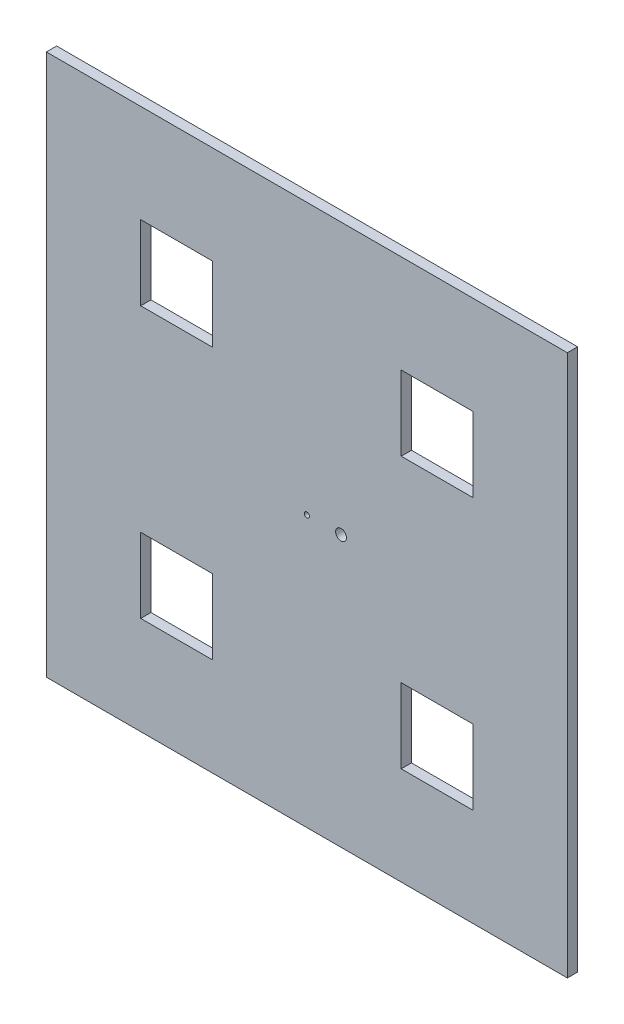
ISO-10303-21;
HEADER;
FILE_DESCRIPTION(('STEP AP214'),'2;1');
FILE_NAME('part.step','',(''),(''),'','','');
FILE_SCHEMA(('AUTOMOTIVE_DESIGN { 1 0 10303 214 1 1 1 1 }'));
ENDSEC;
DATA;
#1=APPLICATION_CONTEXT('core data for automotive mechanical design processes');
#2=APPLICATION_PROTOCOL_DEFINITION('international standard','automotive_design',2000,#1);
#3=PRODUCT_CONTEXT('',#1,'mechanical');
#4=PRODUCT('Part','Part','',(#3));
#5=PRODUCT_RELATED_PRODUCT_CATEGORY('part','',(#4));
#6=PRODUCT_DEFINITION_FORMATION('','',#4);
#7=PRODUCT_DEFINITION_CONTEXT('part definition',#1,'design');
#8=PRODUCT_DEFINITION('design','',#6,#7);
#9=PRODUCT_DEFINITION_SHAPE('','',#8);
#10=(LENGTH_UNIT() NAMED_UNIT(*) SI_UNIT(.MILLI.,.METRE.));
#11=(NAMED_UNIT(*) PLANE_ANGLE_UNIT() SI_UNIT($,.RADIAN.));
#12=(NAMED_UNIT(*) SI_UNIT($,.STERADIAN.) SOLID_ANGLE_UNIT());
#13=UNCERTAINTY_MEASURE_WITH_UNIT(LENGTH_MEASURE(1.E-05),#10,'distance_accuracy_value','');
#14=(GEOMETRIC_REPRESENTATION_CONTEXT(3) GLOBAL_UNCERTAINTY_ASSIGNED_CONTEXT((#13)) GLOBAL_UNIT_ASSIGNED_CONTEXT((#10,
#11,#12)) REPRESENTATION_CONTEXT('',''));
#15=CARTESIAN_POINT('',(0.,0.,0.));
#16=DIRECTION('',(0.,0.,1.));
#17=DIRECTION('',(1.,0.,0.));
#18=AXIS2_PLACEMENT_3D('',#15,#16,#17);
#19=CARTESIAN_POINT('',(-152.4,-158.4,6.));
#20=DIRECTION('',(1.,0.,0.));
#21=DIRECTION('',(0.,0.,-1.));
#22=AXIS2_PLACEMENT_3D('',#19,#20,#21);
#23=PLANE('',#22);
#24=DIRECTION('',(0.,-1.,0.));
#25=VECTOR('',#24,1.);
#26=CARTESIAN_POINT('',(-152.4,-158.4,0.));
#27=LINE('',#26,#25);
#28=CARTESIAN_POINT('',(-152.4,158.4,0.));
#29=VERTEX_POINT('',#28);
#30=CARTESIAN_POINT('',(-152.4,-158.4,0.));
#31=VERTEX_POINT('',#30);
#32=EDGE_CURVE('E300',#29,#31,#27,.T.);
#33=ORIENTED_EDGE('',*,*,#32,.T.);
#34=DIRECTION('',(0.,0.,-1.));
#35=VECTOR('',#34,1.);
#36=CARTESIAN_POINT('',(-152.4,-158.4,6.));
#37=LINE('',#36,#35);
#38=CARTESIAN_POINT('',(-152.4,-158.4,6.));
#39=VERTEX_POINT('',#38);
#40=EDGE_CURVE('E11',#39,#31,#37,.T.);
#41=ORIENTED_EDGE('',*,*,#40,.F.);
#42=DIRECTION('',(0.,-1.,0.));
#43=VECTOR('',#42,1.);
#44=CARTESIAN_POINT('',(-152.4,-158.4,6.));
#45=LINE('',#44,#43);
#46=CARTESIAN_POINT('',(-152.4,158.4,6.));
#47=VERTEX_POINT('',#46);
#48=EDGE_CURVE('E307',#47,#39,#45,.T.);
#49=ORIENTED_EDGE('',*,*,#48,.F.);
#50=DIRECTION('',(0.,0.,-1.));
#51=VECTOR('',#50,1.);
#52=CARTESIAN_POINT('',(-152.4,158.4,6.));
#53=LINE('',#52,#51);
#54=EDGE_CURVE('E317',#47,#29,#53,.T.);
#55=ORIENTED_EDGE('',*,*,#54,.T.);
#56=EDGE_LOOP('',(#33,#41,#49,#55));
#57=FACE_BOUND('',#56,.T.);
#58=ADVANCED_FACE('F33',(#57),#23,.F.);
#59=CARTESIAN_POINT('',(152.4,-158.4,6.));
#60=DIRECTION('',(0.,1.,0.));
#61=DIRECTION('',(-1.,0.,0.));
#62=AXIS2_PLACEMENT_3D('',#59,#60,#61);
#63=PLANE('',#62);
#64=DIRECTION('',(1.,0.,0.));
#65=VECTOR('',#64,1.);
#66=CARTESIAN_POINT('',(152.4,-158.4,0.));
#67=LINE('',#66,#65);
#68=CARTESIAN_POINT('',(152.4,-158.4,0.));
#69=VERTEX_POINT('',#68);
#70=EDGE_CURVE('E320',#31,#69,#67,.T.);
#71=ORIENTED_EDGE('',*,*,#70,.T.);
#72=DIRECTION('',(0.,0.,-1.));
#73=VECTOR('',#72,1.);
#74=CARTESIAN_POINT('',(152.4,-158.4,6.));
#75=LINE('',#74,#73);
#76=CARTESIAN_POINT('',(152.4,-158.4,6.));
#77=VERTEX_POINT('',#76);
#78=EDGE_CURVE('E40',#77,#69,#75,.T.);
#79=ORIENTED_EDGE('',*,*,#78,.F.);
#80=DIRECTION('',(1.,0.,0.));
#81=VECTOR('',#80,1.);
#82=CARTESIAN_POINT('',(152.4,-158.4,6.));
#83=LINE('',#82,#81);
#84=EDGE_CURVE('E310',#39,#77,#83,.T.);
#85=ORIENTED_EDGE('',*,*,#84,.F.);
#86=ORIENTED_EDGE('',*,*,#40,.T.);
#87=EDGE_LOOP('',(#71,#79,#85,#86));
#88=FACE_BOUND('',#87,.T.);
#89=ADVANCED_FACE('F349',(#88),#63,.F.);
#90=CARTESIAN_POINT('',(152.4,-158.4,6.));
#91=DIRECTION('',(-1.,0.,0.));
#92=DIRECTION('',(0.,0.,1.));
#93=AXIS2_PLACEMENT_3D('',#90,#91,#92);
#94=PLANE('',#93);
#95=DIRECTION('',(0.,1.,0.));
#96=VECTOR('',#95,1.);
#97=CARTESIAN_POINT('',(152.4,-158.4,0.));
#98=LINE('',#97,#96);
#99=CARTESIAN_POINT('',(152.4,158.4,0.));
#100=VERTEX_POINT('',#99);
#101=EDGE_CURVE('E322',#69,#100,#98,.T.);
#102=ORIENTED_EDGE('',*,*,#101,.T.);
#103=DIRECTION('',(0.,0.,-1.));
#104=VECTOR('',#103,1.);
#105=CARTESIAN_POINT('',(152.4,158.4,6.));
#106=LINE('',#105,#104);
#107=CARTESIAN_POINT('',(152.4,158.4,6.));
#108=VERTEX_POINT('',#107);
#109=EDGE_CURVE('E327',#108,#100,#106,.T.);
#110=ORIENTED_EDGE('',*,*,#109,.F.);
#111=DIRECTION('',(0.,1.,0.));
#112=VECTOR('',#111,1.);
#113=CARTESIAN_POINT('',(152.4,-158.4,6.));
#114=LINE('',#113,#112);
#115=EDGE_CURVE('E313',#77,#108,#114,.T.);
#116=ORIENTED_EDGE('',*,*,#115,.F.);
#117=ORIENTED_EDGE('',*,*,#78,.T.);
#118=EDGE_LOOP('',(#102,#110,#116,#117));
#119=FACE_BOUND('',#118,.T.);
#120=ADVANCED_FACE('F334',(#119),#94,.F.);
#121=CARTESIAN_POINT('',(152.4,158.4,6.));
#122=DIRECTION('',(0.,-1.,0.));
#123=DIRECTION('',(1.,0.,0.));
#124=AXIS2_PLACEMENT_3D('',#121,#122,#123);
#125=PLANE('',#124);
#126=DIRECTION('',(-1.,0.,0.));
#127=VECTOR('',#126,1.);
#128=CARTESIAN_POINT('',(152.4,158.4,0.));
#129=LINE('',#128,#127);
#130=EDGE_CURVE('E311',#100,#29,#129,.T.);
#131=ORIENTED_EDGE('',*,*,#130,.T.);
#132=ORIENTED_EDGE('',*,*,#54,.F.);
#133=DIRECTION('',(-1.,0.,0.));
#134=VECTOR('',#133,1.);
#135=CARTESIAN_POINT('',(152.4,158.4,6.));
#136=LINE('',#135,#134);
#137=EDGE_CURVE('E315',#108,#47,#136,.T.);
#138=ORIENTED_EDGE('',*,*,#137,.F.);
#139=ORIENTED_EDGE('',*,*,#109,.T.);
#140=EDGE_LOOP('',(#131,#132,#138,#139));
#141=FACE_BOUND('',#140,.T.);
#142=ADVANCED_FACE('F342',(#141),#125,.F.);
#143=CARTESIAN_POINT('',(0.,0.,6.));
#144=DIRECTION('',(0.,0.,1.));
#145=DIRECTION('',(1.,0.,0.));
#146=AXIS2_PLACEMENT_3D('',#143,#144,#145);
#147=PLANE('',#146);
#148=CARTESIAN_POINT('',(20.,0.,6.));
#149=DIRECTION('',(0.,0.,1.));
#150=DIRECTION('',(1.,0.,0.));
#151=AXIS2_PLACEMENT_3D('',#148,#149,#150);
#152=CIRCLE('',#151,3.17500000000001);
#153=CARTESIAN_POINT('',(23.175,0.,6.));
#154=VERTEX_POINT('',#153);
#155=EDGE_CURVE('E439',#154,#154,#152,.T.);
#156=ORIENTED_EDGE('',*,*,#155,.F.);
#157=EDGE_LOOP('',(#156));
#158=FACE_BOUND('',#157,.T.);
#159=CARTESIAN_POINT('',(0.,0.,6.));
#160=DIRECTION('',(0.,0.,1.));
#161=DIRECTION('',(1.,0.,0.));
#162=AXIS2_PLACEMENT_3D('',#159,#160,#161);
#163=CIRCLE('',#162,1.5);
#164=CARTESIAN_POINT('',(1.5,0.,6.));
#165=VERTEX_POINT('',#164);
#166=EDGE_CURVE('E196',#165,#165,#163,.T.);
#167=ORIENTED_EDGE('',*,*,#166,.F.);
#168=EDGE_LOOP('',(#167));
#169=FACE_BOUND('',#168,.T.);
#170=DIRECTION('',(0.,-1.,0.));
#171=VECTOR('',#170,1.);
#172=CARTESIAN_POINT('',(55.2000000000001,57.3732283464567,6.));
#173=LINE('',#172,#171);
#174=CARTESIAN_POINT('',(55.2000000000001,101.026771653543,6.));
#175=VERTEX_POINT('',#174);
#176=CARTESIAN_POINT('',(55.2000000000001,57.3732283464567,6.));
#177=VERTEX_POINT('',#176);
#178=EDGE_CURVE('E47',#175,#177,#173,.T.);
#179=ORIENTED_EDGE('',*,*,#178,.F.);
#180=DIRECTION('',(-1.,0.,0.));
#181=VECTOR('',#180,1.);
#182=CARTESIAN_POINT('',(97.2000000000001,101.026771653543,6.));
#183=LINE('',#182,#181);
#184=CARTESIAN_POINT('',(97.2000000000001,101.026771653543,6.));
#185=VERTEX_POINT('',#184);
#186=EDGE_CURVE('E190',#185,#175,#183,.T.);
#187=ORIENTED_EDGE('',*,*,#186,.F.);
#188=DIRECTION('',(0.,1.,0.));
#189=VECTOR('',#188,1.);
#190=CARTESIAN_POINT('',(97.2000000000001,57.3732283464567,6.));
#191=LINE('',#190,#189);
#192=CARTESIAN_POINT('',(97.2000000000001,57.3732283464567,6.));
#193=VERTEX_POINT('',#192);
#194=EDGE_CURVE('E193',#193,#185,#191,.T.);
#195=ORIENTED_EDGE('',*,*,#194,.F.);
#196=DIRECTION('',(1.,0.,0.));
#197=VECTOR('',#196,1.);
#198=CARTESIAN_POINT('',(97.2000000000001,57.3732283464567,6.));
#199=LINE('',#198,#197);
#200=EDGE_CURVE('E202',#177,#193,#199,.T.);
#201=ORIENTED_EDGE('',*,*,#200,.F.);
#202=EDGE_LOOP('',(#179,#187,#195,#201));
#203=FACE_BOUND('',#202,.T.);
#204=DIRECTION('',(0.,-1.,0.));
#205=VECTOR('',#204,1.);
#206=CARTESIAN_POINT('',(55.2000000000001,-101.026771653543,6.));
#207=LINE('',#206,#205);
#208=CARTESIAN_POINT('',(55.2000000000001,-57.3732283464567,6.));
#209=VERTEX_POINT('',#208);
#210=CARTESIAN_POINT('',(55.2000000000001,-101.026771653543,6.));
#211=VERTEX_POINT('',#210);
#212=EDGE_CURVE('E55',#209,#211,#207,.T.);
#213=ORIENTED_EDGE('',*,*,#212,.F.);
#214=DIRECTION('',(-1.,0.,0.));
#215=VECTOR('',#214,1.);
#216=CARTESIAN_POINT('',(97.2000000000001,-57.3732283464567,6.));
#217=LINE('',#216,#215);
#218=CARTESIAN_POINT('',(97.2000000000001,-57.3732283464567,6.));
#219=VERTEX_POINT('',#218);
#220=EDGE_CURVE('E217',#219,#209,#217,.T.);
#221=ORIENTED_EDGE('',*,*,#220,.F.);
#222=DIRECTION('',(0.,1.,0.));
#223=VECTOR('',#222,1.);
#224=CARTESIAN_POINT('',(97.2000000000001,-101.026771653543,6.));
#225=LINE('',#224,#223);
#226=CARTESIAN_POINT('',(97.2000000000001,-101.026771653543,6.));
#227=VERTEX_POINT('',#226);
#228=EDGE_CURVE('E232',#227,#219,#225,.T.);
#229=ORIENTED_EDGE('',*,*,#228,.F.);
#230=DIRECTION('',(1.,0.,0.));
#231=VECTOR('',#230,1.);
#232=CARTESIAN_POINT('',(97.2000000000001,-101.026771653543,6.));
#233=LINE('',#232,#231);
#234=EDGE_CURVE('E228',#211,#227,#233,.T.);
#235=ORIENTED_EDGE('',*,*,#234,.F.);
#236=EDGE_LOOP('',(#213,#221,#229,#235));
#237=FACE_BOUND('',#236,.T.);
#238=DIRECTION('',(0.,-1.,0.));
#239=VECTOR('',#238,1.);
#240=CARTESIAN_POINT('',(-97.2,-101.026771653543,6.));
#241=LINE('',#240,#239);
#242=CARTESIAN_POINT('',(-97.2,-57.3732283464567,6.));
#243=VERTEX_POINT('',#242);
#244=CARTESIAN_POINT('',(-97.2,-101.026771653543,6.));
#245=VERTEX_POINT('',#244);
#246=EDGE_CURVE('E257',#243,#245,#241,.T.);
#247=ORIENTED_EDGE('',*,*,#246,.F.);
#248=DIRECTION('',(-1.,0.,0.));
#249=VECTOR('',#248,1.);
#250=CARTESIAN_POINT('',(-55.2,-57.3732283464567,6.));
#251=LINE('',#250,#249);
#252=CARTESIAN_POINT('',(-55.2,-57.3732283464567,6.));
#253=VERTEX_POINT('',#252);
#254=EDGE_CURVE('E247',#253,#243,#251,.T.);
#255=ORIENTED_EDGE('',*,*,#254,.F.);
#256=DIRECTION('',(0.,1.,0.));
#257=VECTOR('',#256,1.);
#258=CARTESIAN_POINT('',(-55.2,-101.026771653543,6.));
#259=LINE('',#258,#257);
#260=CARTESIAN_POINT('',(-55.2,-101.026771653543,6.));
#261=VERTEX_POINT('',#260);
#262=EDGE_CURVE('E263',#261,#253,#259,.T.);
#263=ORIENTED_EDGE('',*,*,#262,.F.);
#264=DIRECTION('',(1.,0.,0.));
#265=VECTOR('',#264,1.);
#266=CARTESIAN_POINT('',(-55.2,-101.026771653543,6.));
#267=LINE('',#266,#265);
#268=EDGE_CURVE('E259',#245,#261,#267,.T.);
#269=ORIENTED_EDGE('',*,*,#268,.F.);
#270=EDGE_LOOP('',(#247,#255,#263,#269));
#271=FACE_BOUND('',#270,.T.);
#272=DIRECTION('',(0.,-1.,0.));
#273=VECTOR('',#272,1.);
#274=CARTESIAN_POINT('',(-97.2000000000001,57.3732283464567,6.));
#275=LINE('',#274,#273);
#276=CARTESIAN_POINT('',(-97.2000000000001,101.026771653543,6.));
#277=VERTEX_POINT('',#276);
#278=CARTESIAN_POINT('',(-97.2000000000001,57.3732283464567,6.));
#279=VERTEX_POINT('',#278);
#280=EDGE_CURVE('E209',#277,#279,#275,.T.);
#281=ORIENTED_EDGE('',*,*,#280,.F.);
#282=DIRECTION('',(-1.,0.,0.));
#283=VECTOR('',#282,1.);
#284=CARTESIAN_POINT('',(-55.2000000000001,101.026771653543,6.));
#285=LINE('',#284,#283);
#286=CARTESIAN_POINT('',(-55.2000000000001,101.026771653543,6.));
#287=VERTEX_POINT('',#286);
#288=EDGE_CURVE('E279',#287,#277,#285,.T.);
#289=ORIENTED_EDGE('',*,*,#288,.F.);
#290=DIRECTION('',(0.,1.,0.));
#291=VECTOR('',#290,1.);
#292=CARTESIAN_POINT('',(-55.2000000000001,57.3732283464567,6.));
#293=LINE('',#292,#291);
#294=CARTESIAN_POINT('',(-55.2000000000001,57.3732283464567,6.));
#295=VERTEX_POINT('',#294);
#296=EDGE_CURVE('E293',#295,#287,#293,.T.);
#297=ORIENTED_EDGE('',*,*,#296,.F.);
#298=DIRECTION('',(1.,0.,0.));
#299=VECTOR('',#298,1.);
#300=CARTESIAN_POINT('',(-55.2000000000001,57.3732283464567,6.));
#301=LINE('',#300,#299);
#302=EDGE_CURVE('E290',#279,#295,#301,.T.);
#303=ORIENTED_EDGE('',*,*,#302,.F.);
#304=EDGE_LOOP('',(#281,#289,#297,#303));
#305=FACE_BOUND('',#304,.T.);
#306=ORIENTED_EDGE('',*,*,#48,.T.);
#307=ORIENTED_EDGE('',*,*,#84,.T.);
#308=ORIENTED_EDGE('',*,*,#115,.T.);
#309=ORIENTED_EDGE('',*,*,#137,.T.);
#310=EDGE_LOOP('',(#306,#307,#308,#309));
#311=FACE_BOUND('',#310,.T.);
#312=ADVANCED_FACE('F348',(#158,#169,#203,#237,#271,#305,#311),#147,.T.);
#313=CARTESIAN_POINT('',(0.,0.,0.));
#314=DIRECTION('',(0.,0.,1.));
#315=DIRECTION('',(1.,0.,0.));
#316=AXIS2_PLACEMENT_3D('',#313,#314,#315);
#317=PLANE('',#316);
#318=CARTESIAN_POINT('',(20.,0.,0.));
#319=DIRECTION('',(0.,0.,1.));
#320=DIRECTION('',(1.,0.,0.));
#321=AXIS2_PLACEMENT_3D('',#318,#319,#320);
#322=CIRCLE('',#321,3.17500000000001);
#323=CARTESIAN_POINT('',(23.175,0.,0.));
#324=VERTEX_POINT('',#323);
#325=EDGE_CURVE('E436',#324,#324,#322,.T.);
#326=ORIENTED_EDGE('',*,*,#325,.T.);
#327=EDGE_LOOP('',(#326));
#328=FACE_BOUND('',#327,.T.);
#329=CARTESIAN_POINT('',(0.,0.,0.));
#330=DIRECTION('',(0.,0.,1.));
#331=DIRECTION('',(1.,0.,0.));
#332=AXIS2_PLACEMENT_3D('',#329,#330,#331);
#333=CIRCLE('',#332,1.5);
#334=CARTESIAN_POINT('',(1.5,0.,0.));
#335=VERTEX_POINT('',#334);
#336=EDGE_CURVE('E260',#335,#335,#333,.T.);
#337=ORIENTED_EDGE('',*,*,#336,.T.);
#338=EDGE_LOOP('',(#337));
#339=FACE_BOUND('',#338,.T.);
#340=DIRECTION('',(-1.,0.,0.));
#341=VECTOR('',#340,1.);
#342=CARTESIAN_POINT('',(97.2000000000001,101.026771653543,0.));
#343=LINE('',#342,#341);
#344=CARTESIAN_POINT('',(97.2000000000001,101.026771653543,0.));
#345=VERTEX_POINT('',#344);
#346=CARTESIAN_POINT('',(55.2000000000001,101.026771653543,0.));
#347=VERTEX_POINT('',#346);
#348=EDGE_CURVE('E177',#345,#347,#343,.T.);
#349=ORIENTED_EDGE('',*,*,#348,.T.);
#350=DIRECTION('',(0.,-1.,0.));
#351=VECTOR('',#350,1.);
#352=CARTESIAN_POINT('',(55.2000000000001,57.3732283464567,0.));
#353=LINE('',#352,#351);
#354=CARTESIAN_POINT('',(55.2000000000001,57.3732283464567,0.));
#355=VERTEX_POINT('',#354);
#356=EDGE_CURVE('E171',#347,#355,#353,.T.);
#357=ORIENTED_EDGE('',*,*,#356,.T.);
#358=DIRECTION('',(1.,0.,0.));
#359=VECTOR('',#358,1.);
#360=CARTESIAN_POINT('',(97.2000000000001,57.3732283464567,0.));
#361=LINE('',#360,#359);
#362=CARTESIAN_POINT('',(97.2000000000001,57.3732283464567,0.));
#363=VERTEX_POINT('',#362);
#364=EDGE_CURVE('E181',#355,#363,#361,.T.);
#365=ORIENTED_EDGE('',*,*,#364,.T.);
#366=DIRECTION('',(0.,1.,0.));
#367=VECTOR('',#366,1.);
#368=CARTESIAN_POINT('',(97.2000000000001,57.3732283464567,0.));
#369=LINE('',#368,#367);
#370=EDGE_CURVE('E185',#363,#345,#369,.T.);
#371=ORIENTED_EDGE('',*,*,#370,.T.);
#372=EDGE_LOOP('',(#349,#357,#365,#371));
#373=FACE_BOUND('',#372,.T.);
#374=DIRECTION('',(-1.,0.,0.));
#375=VECTOR('',#374,1.);
#376=CARTESIAN_POINT('',(97.2000000000001,-57.3732283464567,0.));
#377=LINE('',#376,#375);
#378=CARTESIAN_POINT('',(97.2000000000001,-57.3732283464567,0.));
#379=VERTEX_POINT('',#378);
#380=CARTESIAN_POINT('',(55.2000000000001,-57.3732283464567,0.));
#381=VERTEX_POINT('',#380);
#382=EDGE_CURVE('E223',#379,#381,#377,.T.);
#383=ORIENTED_EDGE('',*,*,#382,.T.);
#384=DIRECTION('',(0.,-1.,0.));
#385=VECTOR('',#384,1.);
#386=CARTESIAN_POINT('',(55.2000000000001,-101.026771653543,0.));
#387=LINE('',#386,#385);
#388=CARTESIAN_POINT('',(55.2000000000001,-101.026771653543,0.));
#389=VERTEX_POINT('',#388);
#390=EDGE_CURVE('E213',#381,#389,#387,.T.);
#391=ORIENTED_EDGE('',*,*,#390,.T.);
#392=DIRECTION('',(1.,0.,0.));
#393=VECTOR('',#392,1.);
#394=CARTESIAN_POINT('',(97.2000000000001,-101.026771653543,0.));
#395=LINE('',#394,#393);
#396=CARTESIAN_POINT('',(97.2000000000001,-101.026771653543,0.));
#397=VERTEX_POINT('',#396);
#398=EDGE_CURVE('E216',#389,#397,#395,.T.);
#399=ORIENTED_EDGE('',*,*,#398,.T.);
#400=DIRECTION('',(0.,1.,0.));
#401=VECTOR('',#400,1.);
#402=CARTESIAN_POINT('',(97.2000000000001,-101.026771653543,0.));
#403=LINE('',#402,#401);
#404=EDGE_CURVE('E220',#397,#379,#403,.T.);
#405=ORIENTED_EDGE('',*,*,#404,.T.);
#406=EDGE_LOOP('',(#383,#391,#399,#405));
#407=FACE_BOUND('',#406,.T.);
#408=DIRECTION('',(-1.,0.,0.));
#409=VECTOR('',#408,1.);
#410=CARTESIAN_POINT('',(-55.2,-57.3732283464567,0.));
#411=LINE('',#410,#409);
#412=CARTESIAN_POINT('',(-55.2,-57.3732283464567,0.));
#413=VERTEX_POINT('',#412);
#414=CARTESIAN_POINT('',(-97.2,-57.3732283464567,0.));
#415=VERTEX_POINT('',#414);
#416=EDGE_CURVE('E253',#413,#415,#411,.T.);
#417=ORIENTED_EDGE('',*,*,#416,.T.);
#418=DIRECTION('',(0.,-1.,0.));
#419=VECTOR('',#418,1.);
#420=CARTESIAN_POINT('',(-97.2,-101.026771653543,0.));
#421=LINE('',#420,#419);
#422=CARTESIAN_POINT('',(-97.2,-101.026771653543,0.));
#423=VERTEX_POINT('',#422);
#424=EDGE_CURVE('E243',#415,#423,#421,.T.);
#425=ORIENTED_EDGE('',*,*,#424,.T.);
#426=DIRECTION('',(1.,0.,0.));
#427=VECTOR('',#426,1.);
#428=CARTESIAN_POINT('',(-55.2,-101.026771653543,0.));
#429=LINE('',#428,#427);
#430=CARTESIAN_POINT('',(-55.2,-101.026771653543,0.));
#431=VERTEX_POINT('',#430);
#432=EDGE_CURVE('E246',#423,#431,#429,.T.);
#433=ORIENTED_EDGE('',*,*,#432,.T.);
#434=DIRECTION('',(0.,1.,0.));
#435=VECTOR('',#434,1.);
#436=CARTESIAN_POINT('',(-55.2,-101.026771653543,0.));
#437=LINE('',#436,#435);
#438=EDGE_CURVE('E250',#431,#413,#437,.T.);
#439=ORIENTED_EDGE('',*,*,#438,.T.);
#440=EDGE_LOOP('',(#417,#425,#433,#439));
#441=FACE_BOUND('',#440,.T.);
#442=DIRECTION('',(-1.,0.,0.));
#443=VECTOR('',#442,1.);
#444=CARTESIAN_POINT('',(-55.2000000000001,101.026771653543,0.));
#445=LINE('',#444,#443);
#446=CARTESIAN_POINT('',(-55.2000000000001,101.026771653543,0.));
#447=VERTEX_POINT('',#446);
#448=CARTESIAN_POINT('',(-97.2000000000001,101.026771653543,0.));
#449=VERTEX_POINT('',#448);
#450=EDGE_CURVE('E285',#447,#449,#445,.T.);
#451=ORIENTED_EDGE('',*,*,#450,.T.);
#452=DIRECTION('',(0.,-1.,0.));
#453=VECTOR('',#452,1.);
#454=CARTESIAN_POINT('',(-97.2000000000001,57.3732283464567,0.));
#455=LINE('',#454,#453);
#456=CARTESIAN_POINT('',(-97.2000000000001,57.3732283464567,0.));
#457=VERTEX_POINT('',#456);
#458=EDGE_CURVE('E275',#449,#457,#455,.T.);
#459=ORIENTED_EDGE('',*,*,#458,.T.);
#460=DIRECTION('',(1.,0.,0.));
#461=VECTOR('',#460,1.);
#462=CARTESIAN_POINT('',(-55.2000000000001,57.3732283464567,0.));
#463=LINE('',#462,#461);
#464=CARTESIAN_POINT('',(-55.2000000000001,57.3732283464567,0.));
#465=VERTEX_POINT('',#464);
#466=EDGE_CURVE('E278',#457,#465,#463,.T.);
#467=ORIENTED_EDGE('',*,*,#466,.T.);
#468=DIRECTION('',(0.,1.,0.));
#469=VECTOR('',#468,1.);
#470=CARTESIAN_POINT('',(-55.2000000000001,57.3732283464567,0.));
#471=LINE('',#470,#469);
#472=EDGE_CURVE('E282',#465,#447,#471,.T.);
#473=ORIENTED_EDGE('',*,*,#472,.T.);
#474=EDGE_LOOP('',(#451,#459,#467,#473));
#475=FACE_BOUND('',#474,.T.);
#476=ORIENTED_EDGE('',*,*,#32,.F.);
#477=ORIENTED_EDGE('',*,*,#130,.F.);
#478=ORIENTED_EDGE('',*,*,#101,.F.);
#479=ORIENTED_EDGE('',*,*,#70,.F.);
#480=EDGE_LOOP('',(#476,#477,#478,#479));
#481=FACE_BOUND('',#480,.T.);
#482=ADVANCED_FACE('F187',(#328,#339,#373,#407,#441,#475,#481),#317,.F.);
#483=CARTESIAN_POINT('',(-97.2000000000001,57.3732283464567,0.));
#484=DIRECTION('',(-1.,0.,0.));
#485=DIRECTION('',(0.,0.,1.));
#486=AXIS2_PLACEMENT_3D('',#483,#484,#485);
#487=PLANE('',#486);
#488=ORIENTED_EDGE('',*,*,#280,.T.);
#489=DIRECTION('',(0.,0.,1.));
#490=VECTOR('',#489,1.);
#491=CARTESIAN_POINT('',(-97.2000000000001,57.3732283464567,0.));
#492=LINE('',#491,#490);
#493=EDGE_CURVE('E288',#457,#279,#492,.T.);
#494=ORIENTED_EDGE('',*,*,#493,.F.);
#495=ORIENTED_EDGE('',*,*,#458,.F.);
#496=DIRECTION('',(0.,0.,1.));
#497=VECTOR('',#496,1.);
#498=CARTESIAN_POINT('',(-97.2000000000001,101.026771653543,0.));
#499=LINE('',#498,#497);
#500=EDGE_CURVE('E298',#449,#277,#499,.T.);
#501=ORIENTED_EDGE('',*,*,#500,.T.);
#502=EDGE_LOOP('',(#488,#494,#495,#501));
#503=FACE_BOUND('',#502,.T.);
#504=ADVANCED_FACE('F361',(#503),#487,.F.);
#505=CARTESIAN_POINT('',(-55.2000000000001,101.026771653543,0.));
#506=DIRECTION('',(0.,1.,0.));
#507=DIRECTION('',(-1.,0.,0.));
#508=AXIS2_PLACEMENT_3D('',#505,#506,#507);
#509=PLANE('',#508);
#510=ORIENTED_EDGE('',*,*,#288,.T.);
#511=ORIENTED_EDGE('',*,*,#500,.F.);
#512=ORIENTED_EDGE('',*,*,#450,.F.);
#513=DIRECTION('',(0.,0.,1.));
#514=VECTOR('',#513,1.);
#515=CARTESIAN_POINT('',(-55.2000000000001,101.026771653543,0.));
#516=LINE('',#515,#514);
#517=EDGE_CURVE('E301',#447,#287,#516,.T.);
#518=ORIENTED_EDGE('',*,*,#517,.T.);
#519=EDGE_LOOP('',(#510,#511,#512,#518));
#520=FACE_BOUND('',#519,.T.);
#521=ADVANCED_FACE('F368',(#520),#509,.F.);
#522=CARTESIAN_POINT('',(-55.2000000000001,57.3732283464567,0.));
#523=DIRECTION('',(1.,0.,0.));
#524=DIRECTION('',(0.,0.,-1.));
#525=AXIS2_PLACEMENT_3D('',#522,#523,#524);
#526=PLANE('',#525);
#527=ORIENTED_EDGE('',*,*,#296,.T.);
#528=ORIENTED_EDGE('',*,*,#517,.F.);
#529=ORIENTED_EDGE('',*,*,#472,.F.);
#530=DIRECTION('',(0.,0.,1.));
#531=VECTOR('',#530,1.);
#532=CARTESIAN_POINT('',(-55.2000000000001,57.3732283464567,0.));
#533=LINE('',#532,#531);
#534=EDGE_CURVE('E303',#465,#295,#533,.T.);
#535=ORIENTED_EDGE('',*,*,#534,.T.);
#536=EDGE_LOOP('',(#527,#528,#529,#535));
#537=FACE_BOUND('',#536,.T.);
#538=ADVANCED_FACE('F374',(#537),#526,.F.);
#539=CARTESIAN_POINT('',(-55.2000000000001,57.3732283464567,0.));
#540=DIRECTION('',(0.,-1.,0.));
#541=DIRECTION('',(1.,0.,0.));
#542=AXIS2_PLACEMENT_3D('',#539,#540,#541);
#543=PLANE('',#542);
#544=ORIENTED_EDGE('',*,*,#302,.T.);
#545=ORIENTED_EDGE('',*,*,#534,.F.);
#546=ORIENTED_EDGE('',*,*,#466,.F.);
#547=ORIENTED_EDGE('',*,*,#493,.T.);
#548=EDGE_LOOP('',(#544,#545,#546,#547));
#549=FACE_BOUND('',#548,.T.);
#550=ADVANCED_FACE('F370',(#549),#543,.F.);
#551=CARTESIAN_POINT('',(-97.2,-101.026771653543,0.));
#552=DIRECTION('',(-1.,0.,0.));
#553=DIRECTION('',(0.,0.,1.));
#554=AXIS2_PLACEMENT_3D('',#551,#552,#553);
#555=PLANE('',#554);
#556=ORIENTED_EDGE('',*,*,#246,.T.);
#557=DIRECTION('',(0.,0.,1.));
#558=VECTOR('',#557,1.);
#559=CARTESIAN_POINT('',(-97.2,-101.026771653543,0.));
#560=LINE('',#559,#558);
#561=EDGE_CURVE('E256',#423,#245,#560,.T.);
#562=ORIENTED_EDGE('',*,*,#561,.F.);
#563=ORIENTED_EDGE('',*,*,#424,.F.);
#564=DIRECTION('',(0.,0.,1.));
#565=VECTOR('',#564,1.);
#566=CARTESIAN_POINT('',(-97.2,-57.3732283464567,0.));
#567=LINE('',#566,#565);
#568=EDGE_CURVE('E229',#415,#243,#567,.T.);
#569=ORIENTED_EDGE('',*,*,#568,.T.);
#570=EDGE_LOOP('',(#556,#562,#563,#569));
#571=FACE_BOUND('',#570,.T.);
#572=ADVANCED_FACE('F373',(#571),#555,.F.);
#573=CARTESIAN_POINT('',(-55.2,-57.3732283464567,0.));
#574=DIRECTION('',(0.,1.,0.));
#575=DIRECTION('',(-1.,0.,0.));
#576=AXIS2_PLACEMENT_3D('',#573,#574,#575);
#577=PLANE('',#576);
#578=ORIENTED_EDGE('',*,*,#254,.T.);
#579=ORIENTED_EDGE('',*,*,#568,.F.);
#580=ORIENTED_EDGE('',*,*,#416,.F.);
#581=DIRECTION('',(0.,0.,1.));
#582=VECTOR('',#581,1.);
#583=CARTESIAN_POINT('',(-55.2,-57.3732283464567,0.));
#584=LINE('',#583,#582);
#585=EDGE_CURVE('E269',#413,#253,#584,.T.);
#586=ORIENTED_EDGE('',*,*,#585,.T.);
#587=EDGE_LOOP('',(#578,#579,#580,#586));
#588=FACE_BOUND('',#587,.T.);
#589=ADVANCED_FACE('F384',(#588),#577,.F.);
#590=CARTESIAN_POINT('',(-55.2,-101.026771653543,0.));
#591=DIRECTION('',(1.,0.,0.));
#592=DIRECTION('',(0.,0.,-1.));
#593=AXIS2_PLACEMENT_3D('',#590,#591,#592);
#594=PLANE('',#593);
#595=ORIENTED_EDGE('',*,*,#262,.T.);
#596=ORIENTED_EDGE('',*,*,#585,.F.);
#597=ORIENTED_EDGE('',*,*,#438,.F.);
#598=DIRECTION('',(0.,0.,1.));
#599=VECTOR('',#598,1.);
#600=CARTESIAN_POINT('',(-55.2,-101.026771653543,0.));
#601=LINE('',#600,#599);
#602=EDGE_CURVE('E271',#431,#261,#601,.T.);
#603=ORIENTED_EDGE('',*,*,#602,.T.);
#604=EDGE_LOOP('',(#595,#596,#597,#603));
#605=FACE_BOUND('',#604,.T.);
#606=ADVANCED_FACE('F390',(#605),#594,.F.);
#607=CARTESIAN_POINT('',(-55.2,-101.026771653543,0.));
#608=DIRECTION('',(0.,-1.,0.));
#609=DIRECTION('',(1.,0.,0.));
#610=AXIS2_PLACEMENT_3D('',#607,#608,#609);
#611=PLANE('',#610);
#612=ORIENTED_EDGE('',*,*,#268,.T.);
#613=ORIENTED_EDGE('',*,*,#602,.F.);
#614=ORIENTED_EDGE('',*,*,#432,.F.);
#615=ORIENTED_EDGE('',*,*,#561,.T.);
#616=EDGE_LOOP('',(#612,#613,#614,#615));
#617=FACE_BOUND('',#616,.T.);
#618=ADVANCED_FACE('F386',(#617),#611,.F.);
#619=CARTESIAN_POINT('',(55.2000000000001,-101.026771653543,0.));
#620=DIRECTION('',(-1.,0.,0.));
#621=DIRECTION('',(0.,0.,1.));
#622=AXIS2_PLACEMENT_3D('',#619,#620,#621);
#623=PLANE('',#622);
#624=ORIENTED_EDGE('',*,*,#212,.T.);
#625=DIRECTION('',(0.,0.,1.));
#626=VECTOR('',#625,1.);
#627=CARTESIAN_POINT('',(55.2000000000001,-101.026771653543,0.));
#628=LINE('',#627,#626);
#629=EDGE_CURVE('E226',#389,#211,#628,.T.);
#630=ORIENTED_EDGE('',*,*,#629,.F.);
#631=ORIENTED_EDGE('',*,*,#390,.F.);
#632=DIRECTION('',(0.,0.,1.));
#633=VECTOR('',#632,1.);
#634=CARTESIAN_POINT('',(55.2000000000001,-57.3732283464567,0.));
#635=LINE('',#634,#633);
#636=EDGE_CURVE('E203',#381,#209,#635,.T.);
#637=ORIENTED_EDGE('',*,*,#636,.T.);
#638=EDGE_LOOP('',(#624,#630,#631,#637));
#639=FACE_BOUND('',#638,.T.);
#640=ADVANCED_FACE('F389',(#639),#623,.F.);
#641=CARTESIAN_POINT('',(97.2000000000001,-57.3732283464567,0.));
#642=DIRECTION('',(0.,1.,0.));
#643=DIRECTION('',(-1.,0.,0.));
#644=AXIS2_PLACEMENT_3D('',#641,#642,#643);
#645=PLANE('',#644);
#646=ORIENTED_EDGE('',*,*,#220,.T.);
#647=ORIENTED_EDGE('',*,*,#636,.F.);
#648=ORIENTED_EDGE('',*,*,#382,.F.);
#649=DIRECTION('',(0.,0.,1.));
#650=VECTOR('',#649,1.);
#651=CARTESIAN_POINT('',(97.2000000000001,-57.3732283464567,0.));
#652=LINE('',#651,#650);
#653=EDGE_CURVE('E238',#379,#219,#652,.T.);
#654=ORIENTED_EDGE('',*,*,#653,.T.);
#655=EDGE_LOOP('',(#646,#647,#648,#654));
#656=FACE_BOUND('',#655,.T.);
#657=ADVANCED_FACE('F400',(#656),#645,.F.);
#658=CARTESIAN_POINT('',(97.2000000000001,-101.026771653543,0.));
#659=DIRECTION('',(1.,0.,0.));
#660=DIRECTION('',(0.,0.,-1.));
#661=AXIS2_PLACEMENT_3D('',#658,#659,#660);
#662=PLANE('',#661);
#663=ORIENTED_EDGE('',*,*,#228,.T.);
#664=ORIENTED_EDGE('',*,*,#653,.F.);
#665=ORIENTED_EDGE('',*,*,#404,.F.);
#666=DIRECTION('',(0.,0.,1.));
#667=VECTOR('',#666,1.);
#668=CARTESIAN_POINT('',(97.2000000000001,-101.026771653543,0.));
#669=LINE('',#668,#667);
#670=EDGE_CURVE('E240',#397,#227,#669,.T.);
#671=ORIENTED_EDGE('',*,*,#670,.T.);
#672=EDGE_LOOP('',(#663,#664,#665,#671));
#673=FACE_BOUND('',#672,.T.);
#674=ADVANCED_FACE('F404',(#673),#662,.F.);
#675=CARTESIAN_POINT('',(97.2000000000001,-101.026771653543,0.));
#676=DIRECTION('',(0.,-1.,0.));
#677=DIRECTION('',(1.,0.,0.));
#678=AXIS2_PLACEMENT_3D('',#675,#676,#677);
#679=PLANE('',#678);
#680=ORIENTED_EDGE('',*,*,#234,.T.);
#681=ORIENTED_EDGE('',*,*,#670,.F.);
#682=ORIENTED_EDGE('',*,*,#398,.F.);
#683=ORIENTED_EDGE('',*,*,#629,.T.);
#684=EDGE_LOOP('',(#680,#681,#682,#683));
#685=FACE_BOUND('',#684,.T.);
#686=ADVANCED_FACE('F401',(#685),#679,.F.);
#687=CARTESIAN_POINT('',(55.2000000000001,57.3732283464567,0.));
#688=DIRECTION('',(-1.,0.,0.));
#689=DIRECTION('',(0.,0.,1.));
#690=AXIS2_PLACEMENT_3D('',#687,#688,#689);
#691=PLANE('',#690);
#692=ORIENTED_EDGE('',*,*,#178,.T.);
#693=DIRECTION('',(0.,0.,1.));
#694=VECTOR('',#693,1.);
#695=CARTESIAN_POINT('',(55.2000000000001,57.3732283464567,0.));
#696=LINE('',#695,#694);
#697=EDGE_CURVE('E167',#355,#177,#696,.T.);
#698=ORIENTED_EDGE('',*,*,#697,.F.);
#699=ORIENTED_EDGE('',*,*,#356,.F.);
#700=DIRECTION('',(0.,0.,1.));
#701=VECTOR('',#700,1.);
#702=CARTESIAN_POINT('',(55.2000000000001,101.026771653543,0.));
#703=LINE('',#702,#701);
#704=EDGE_CURVE('E207',#347,#175,#703,.T.);
#705=ORIENTED_EDGE('',*,*,#704,.T.);
#706=EDGE_LOOP('',(#692,#698,#699,#705));
#707=FACE_BOUND('',#706,.T.);
#708=ADVANCED_FACE('F169',(#707),#691,.F.);
#709=CARTESIAN_POINT('',(97.2000000000001,101.026771653543,0.));
#710=DIRECTION('',(0.,1.,0.));
#711=DIRECTION('',(-1.,0.,0.));
#712=AXIS2_PLACEMENT_3D('',#709,#710,#711);
#713=PLANE('',#712);
#714=ORIENTED_EDGE('',*,*,#186,.T.);
#715=ORIENTED_EDGE('',*,*,#704,.F.);
#716=ORIENTED_EDGE('',*,*,#348,.F.);
#717=DIRECTION('',(0.,0.,1.));
#718=VECTOR('',#717,1.);
#719=CARTESIAN_POINT('',(97.2000000000001,101.026771653543,0.));
#720=LINE('',#719,#718);
#721=EDGE_CURVE('E210',#345,#185,#720,.T.);
#722=ORIENTED_EDGE('',*,*,#721,.T.);
#723=EDGE_LOOP('',(#714,#715,#716,#722));
#724=FACE_BOUND('',#723,.T.);
#725=ADVANCED_FACE('F414',(#724),#713,.F.);
#726=CARTESIAN_POINT('',(97.2000000000001,57.3732283464567,0.));
#727=DIRECTION('',(1.,0.,0.));
#728=DIRECTION('',(0.,0.,-1.));
#729=AXIS2_PLACEMENT_3D('',#726,#727,#728);
#730=PLANE('',#729);
#731=ORIENTED_EDGE('',*,*,#194,.T.);
#732=ORIENTED_EDGE('',*,*,#721,.F.);
#733=ORIENTED_EDGE('',*,*,#370,.F.);
#734=DIRECTION('',(0.,0.,1.));
#735=VECTOR('',#734,1.);
#736=CARTESIAN_POINT('',(97.2000000000001,57.3732283464567,0.));
#737=LINE('',#736,#735);
#738=EDGE_CURVE('E176',#363,#193,#737,.T.);
#739=ORIENTED_EDGE('',*,*,#738,.T.);
#740=EDGE_LOOP('',(#731,#732,#733,#739));
#741=FACE_BOUND('',#740,.T.);
#742=ADVANCED_FACE('F418',(#741),#730,.F.);
#743=CARTESIAN_POINT('',(97.2000000000001,57.3732283464567,0.));
#744=DIRECTION('',(0.,-1.,0.));
#745=DIRECTION('',(1.,0.,0.));
#746=AXIS2_PLACEMENT_3D('',#743,#744,#745);
#747=PLANE('',#746);
#748=ORIENTED_EDGE('',*,*,#200,.T.);
#749=ORIENTED_EDGE('',*,*,#738,.F.);
#750=ORIENTED_EDGE('',*,*,#364,.F.);
#751=ORIENTED_EDGE('',*,*,#697,.T.);
#752=EDGE_LOOP('',(#748,#749,#750,#751));
#753=FACE_BOUND('',#752,.T.);
#754=ADVANCED_FACE('F182',(#753),#747,.F.);
#755=CARTESIAN_POINT('',(0.,0.,0.));
#756=DIRECTION('',(0.,0.,1.));
#757=DIRECTION('',(1.,0.,0.));
#758=AXIS2_PLACEMENT_3D('',#755,#756,#757);
#759=CYLINDRICAL_SURFACE('',#758,1.5);
#760=ORIENTED_EDGE('',*,*,#336,.F.);
#761=EDGE_LOOP('',(#760));
#762=FACE_BOUND('',#761,.T.);
#763=ORIENTED_EDGE('',*,*,#166,.T.);
#764=EDGE_LOOP('',(#763));
#765=FACE_BOUND('',#764,.T.);
#766=ADVANCED_FACE('F417',(#762,#765),#759,.F.);
#767=CARTESIAN_POINT('',(20.,0.,0.));
#768=DIRECTION('',(0.,0.,1.));
#769=DIRECTION('',(1.,0.,0.));
#770=AXIS2_PLACEMENT_3D('',#767,#768,#769);
#771=CYLINDRICAL_SURFACE('',#770,3.17500000000001);
#772=ORIENTED_EDGE('',*,*,#325,.F.);
#773=EDGE_LOOP('',(#772));
#774=FACE_BOUND('',#773,.T.);
#775=ORIENTED_EDGE('',*,*,#155,.T.);
#776=EDGE_LOOP('',(#775));
#777=FACE_BOUND('',#776,.T.);
#778=ADVANCED_FACE('F427',(#774,#777),#771,.F.);
#779=CLOSED_SHELL('',(#58,#89,#120,#142,#312,#482,#504,#521,#538,#550,#572,#589,#606,#618,#640,
#657,#674,#686,#708,#725,#742,#754,#766,#778));
#780=MANIFOLD_SOLID_BREP('B2',#779);
#781=ADVANCED_BREP_SHAPE_REPRESENTATION('',(#18,#780),#14);
#782=SHAPE_DEFINITION_REPRESENTATION(#9,#781);
ENDSEC;
END-ISO-10303-21;
